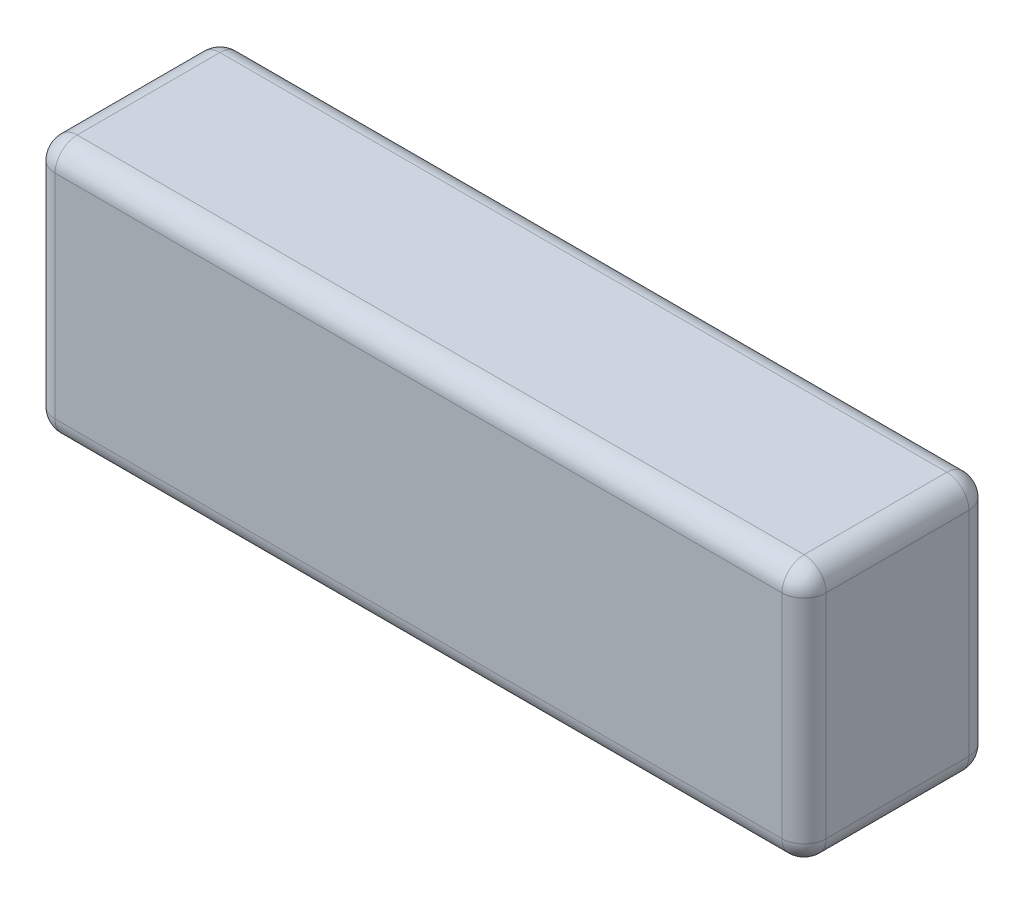
ISO-10303-21;
HEADER;
FILE_DESCRIPTION(('STEP AP214'),'2;1');
FILE_NAME('part.step','',(''),(''),'','','');
FILE_SCHEMA(('AUTOMOTIVE_DESIGN { 1 0 10303 214 1 1 1 1 }'));
ENDSEC;
DATA;
#1=APPLICATION_CONTEXT('core data for automotive mechanical design processes');
#2=APPLICATION_PROTOCOL_DEFINITION('international standard','automotive_design',2000,#1);
#3=PRODUCT_CONTEXT('',#1,'mechanical');
#4=PRODUCT('Part','Part','',(#3));
#5=PRODUCT_RELATED_PRODUCT_CATEGORY('part','',(#4));
#6=PRODUCT_DEFINITION_FORMATION('','',#4);
#7=PRODUCT_DEFINITION_CONTEXT('part definition',#1,'design');
#8=PRODUCT_DEFINITION('design','',#6,#7);
#9=PRODUCT_DEFINITION_SHAPE('','',#8);
#10=(LENGTH_UNIT() NAMED_UNIT(*) SI_UNIT(.MILLI.,.METRE.));
#11=(NAMED_UNIT(*) PLANE_ANGLE_UNIT() SI_UNIT($,.RADIAN.));
#12=(NAMED_UNIT(*) SI_UNIT($,.STERADIAN.) SOLID_ANGLE_UNIT());
#13=UNCERTAINTY_MEASURE_WITH_UNIT(LENGTH_MEASURE(1.E-05),#10,'distance_accuracy_value','');
#14=(GEOMETRIC_REPRESENTATION_CONTEXT(3) GLOBAL_UNCERTAINTY_ASSIGNED_CONTEXT((#13)) GLOBAL_UNIT_ASSIGNED_CONTEXT((#10,
#11,#12)) REPRESENTATION_CONTEXT('',''));
#15=CARTESIAN_POINT('',(0.,0.,0.));
#16=DIRECTION('',(0.,0.,1.));
#17=DIRECTION('',(1.,0.,0.));
#18=AXIS2_PLACEMENT_3D('',#15,#16,#17);
#19=CARTESIAN_POINT('',(-49.3875,14.4625,-9.7));
#20=DIRECTION('',(1.,0.,0.));
#21=DIRECTION('',(0.,0.,-1.));
#22=AXIS2_PLACEMENT_3D('',#19,#20,#21);
#23=CYLINDRICAL_SURFACE('',#22,3.);
#24=CARTESIAN_POINT('',(-49.3875,14.4625,-9.7));
#25=DIRECTION('',(-1.,0.,0.));
#26=DIRECTION('',(0.,0.,1.));
#27=AXIS2_PLACEMENT_3D('',#24,#25,#26);
#28=CIRCLE('',#27,3.);
#29=CARTESIAN_POINT('',(-49.3875,17.4625,-9.7));
#30=VERTEX_POINT('',#29);
#31=CARTESIAN_POINT('',(-49.3875,14.4625,-12.7));
#32=VERTEX_POINT('',#31);
#33=EDGE_CURVE('E11',#30,#32,#28,.T.);
#34=ORIENTED_EDGE('',*,*,#33,.F.);
#35=DIRECTION('',(-1.,0.,0.));
#36=VECTOR('',#35,1.);
#37=CARTESIAN_POINT('',(-49.3875,17.4625,-9.7));
#38=LINE('',#37,#36);
#39=CARTESIAN_POINT('',(49.3875,17.4625,-9.7));
#40=VERTEX_POINT('',#39);
#41=EDGE_CURVE('E247',#40,#30,#38,.T.);
#42=ORIENTED_EDGE('',*,*,#41,.F.);
#43=CARTESIAN_POINT('',(49.3875,14.4625,-9.7));
#44=DIRECTION('',(-1.,0.,0.));
#45=DIRECTION('',(0.,-1.,0.));
#46=AXIS2_PLACEMENT_3D('',#43,#44,#45);
#47=CIRCLE('',#46,3.);
#48=CARTESIAN_POINT('',(49.3875,14.4625,-12.7));
#49=VERTEX_POINT('',#48);
#50=EDGE_CURVE('E42',#40,#49,#47,.T.);
#51=ORIENTED_EDGE('',*,*,#50,.T.);
#52=DIRECTION('',(-1.,0.,0.));
#53=VECTOR('',#52,1.);
#54=CARTESIAN_POINT('',(-49.3875,14.4625,-12.7));
#55=LINE('',#54,#53);
#56=EDGE_CURVE('E223',#32,#49,#55,.F.);
#57=ORIENTED_EDGE('',*,*,#56,.F.);
#58=EDGE_LOOP('',(#34,#42,#51,#57));
#59=FACE_BOUND('',#58,.T.);
#60=ADVANCED_FACE('F35',(#59),#23,.T.);
#61=CARTESIAN_POINT('',(49.3875,14.4625,-9.7));
#62=DIRECTION('',(0.,0.,-1.));
#63=DIRECTION('',(-1.,0.,0.));
#64=AXIS2_PLACEMENT_3D('',#61,#62,#63);
#65=SPHERICAL_SURFACE('',#64,3.);
#66=ORIENTED_EDGE('',*,*,#50,.F.);
#67=CARTESIAN_POINT('',(49.3875,14.4625,-9.7));
#68=DIRECTION('',(0.,0.,-1.));
#69=DIRECTION('',(-1.,0.,0.));
#70=AXIS2_PLACEMENT_3D('',#67,#68,#69);
#71=CIRCLE('',#70,3.);
#72=CARTESIAN_POINT('',(52.3875,14.4625,-9.7));
#73=VERTEX_POINT('',#72);
#74=EDGE_CURVE('E244',#73,#40,#71,.F.);
#75=ORIENTED_EDGE('',*,*,#74,.F.);
#76=CARTESIAN_POINT('',(49.3875,14.4625,-9.7));
#77=DIRECTION('',(0.,1.,0.));
#78=DIRECTION('',(0.,0.,1.));
#79=AXIS2_PLACEMENT_3D('',#76,#77,#78);
#80=CIRCLE('',#79,3.);
#81=EDGE_CURVE('E55',#73,#49,#80,.T.);
#82=ORIENTED_EDGE('',*,*,#81,.T.);
#83=EDGE_LOOP('',(#66,#75,#82));
#84=FACE_BOUND('',#83,.T.);
#85=ADVANCED_FACE('F265',(#84),#65,.T.);
#86=CARTESIAN_POINT('',(49.3875,14.4625,-9.7));
#87=DIRECTION('',(0.,-1.,0.));
#88=DIRECTION('',(0.,0.,-1.));
#89=AXIS2_PLACEMENT_3D('',#86,#87,#88);
#90=CYLINDRICAL_SURFACE('',#89,3.);
#91=ORIENTED_EDGE('',*,*,#81,.F.);
#92=DIRECTION('',(0.,1.,0.));
#93=VECTOR('',#92,1.);
#94=CARTESIAN_POINT('',(52.3875,14.4625,-9.7));
#95=LINE('',#94,#93);
#96=CARTESIAN_POINT('',(52.3875,-14.4625,-9.7));
#97=VERTEX_POINT('',#96);
#98=EDGE_CURVE('E242',#97,#73,#95,.T.);
#99=ORIENTED_EDGE('',*,*,#98,.F.);
#100=CARTESIAN_POINT('',(49.3875,-14.4625,-9.7));
#101=DIRECTION('',(0.,1.,0.));
#102=DIRECTION('',(-1.,0.,0.));
#103=AXIS2_PLACEMENT_3D('',#100,#101,#102);
#104=CIRCLE('',#103,3.);
#105=CARTESIAN_POINT('',(49.3875,-14.4625,-12.7));
#106=VERTEX_POINT('',#105);
#107=EDGE_CURVE('E261',#97,#106,#104,.T.);
#108=ORIENTED_EDGE('',*,*,#107,.T.);
#109=DIRECTION('',(0.,1.,0.));
#110=VECTOR('',#109,1.);
#111=CARTESIAN_POINT('',(49.3875,14.4625,-12.7));
#112=LINE('',#111,#110);
#113=EDGE_CURVE('E226',#49,#106,#112,.F.);
#114=ORIENTED_EDGE('',*,*,#113,.F.);
#115=EDGE_LOOP('',(#91,#99,#108,#114));
#116=FACE_BOUND('',#115,.T.);
#117=ADVANCED_FACE('F266',(#116),#90,.T.);
#118=CARTESIAN_POINT('',(49.3875,-14.4625,-9.7));
#119=DIRECTION('',(0.,0.,-1.));
#120=DIRECTION('',(-1.,0.,0.));
#121=AXIS2_PLACEMENT_3D('',#118,#119,#120);
#122=SPHERICAL_SURFACE('',#121,3.);
#123=ORIENTED_EDGE('',*,*,#107,.F.);
#124=CARTESIAN_POINT('',(49.3875,-14.4625,-9.7));
#125=DIRECTION('',(0.,0.,-1.));
#126=DIRECTION('',(-1.,0.,0.));
#127=AXIS2_PLACEMENT_3D('',#124,#125,#126);
#128=CIRCLE('',#127,3.);
#129=CARTESIAN_POINT('',(49.3875,-17.4625,-9.7));
#130=VERTEX_POINT('',#129);
#131=EDGE_CURVE('E161',#130,#97,#128,.F.);
#132=ORIENTED_EDGE('',*,*,#131,.F.);
#133=CARTESIAN_POINT('',(49.3875,-14.4625,-9.7));
#134=DIRECTION('',(1.,0.,0.));
#135=DIRECTION('',(0.,0.,-1.));
#136=AXIS2_PLACEMENT_3D('',#133,#134,#135);
#137=CIRCLE('',#136,3.);
#138=EDGE_CURVE('E258',#130,#106,#137,.T.);
#139=ORIENTED_EDGE('',*,*,#138,.T.);
#140=EDGE_LOOP('',(#123,#132,#139));
#141=FACE_BOUND('',#140,.T.);
#142=ADVANCED_FACE('F325',(#141),#122,.T.);
#143=CARTESIAN_POINT('',(-49.3875,-14.4625,-9.7));
#144=DIRECTION('',(-1.,0.,0.));
#145=DIRECTION('',(0.,0.,1.));
#146=AXIS2_PLACEMENT_3D('',#143,#144,#145);
#147=CYLINDRICAL_SURFACE('',#146,3.);
#148=ORIENTED_EDGE('',*,*,#138,.F.);
#149=DIRECTION('',(1.,0.,0.));
#150=VECTOR('',#149,1.);
#151=CARTESIAN_POINT('',(-49.3875,-17.4625,-9.7));
#152=LINE('',#151,#150);
#153=CARTESIAN_POINT('',(-49.3875,-17.4625,-9.7));
#154=VERTEX_POINT('',#153);
#155=EDGE_CURVE('E238',#154,#130,#152,.T.);
#156=ORIENTED_EDGE('',*,*,#155,.F.);
#157=CARTESIAN_POINT('',(-49.3875,-14.4625,-9.7));
#158=DIRECTION('',(1.,0.,0.));
#159=DIRECTION('',(0.,1.,0.));
#160=AXIS2_PLACEMENT_3D('',#157,#158,#159);
#161=CIRCLE('',#160,3.);
#162=CARTESIAN_POINT('',(-49.3875,-14.4625,-12.7));
#163=VERTEX_POINT('',#162);
#164=EDGE_CURVE('E256',#154,#163,#161,.T.);
#165=ORIENTED_EDGE('',*,*,#164,.T.);
#166=DIRECTION('',(1.,0.,0.));
#167=VECTOR('',#166,1.);
#168=CARTESIAN_POINT('',(-49.3875,-14.4625,-12.7));
#169=LINE('',#168,#167);
#170=EDGE_CURVE('E229',#106,#163,#169,.F.);
#171=ORIENTED_EDGE('',*,*,#170,.F.);
#172=EDGE_LOOP('',(#148,#156,#165,#171));
#173=FACE_BOUND('',#172,.T.);
#174=ADVANCED_FACE('F323',(#173),#147,.T.);
#175=CARTESIAN_POINT('',(-49.3875,-14.4625,-9.7));
#176=DIRECTION('',(0.,0.,-1.));
#177=DIRECTION('',(-1.,0.,0.));
#178=AXIS2_PLACEMENT_3D('',#175,#176,#177);
#179=SPHERICAL_SURFACE('',#178,3.);
#180=ORIENTED_EDGE('',*,*,#164,.F.);
#181=CARTESIAN_POINT('',(-49.3875,-14.4625,-9.7));
#182=DIRECTION('',(0.,0.,-1.));
#183=DIRECTION('',(-1.,0.,0.));
#184=AXIS2_PLACEMENT_3D('',#181,#182,#183);
#185=CIRCLE('',#184,3.);
#186=CARTESIAN_POINT('',(-52.3875,-14.4625,-9.7));
#187=VERTEX_POINT('',#186);
#188=EDGE_CURVE('E235',#187,#154,#185,.F.);
#189=ORIENTED_EDGE('',*,*,#188,.F.);
#190=CARTESIAN_POINT('',(-49.3875,-14.4625,-9.7));
#191=DIRECTION('',(0.,-1.,0.));
#192=DIRECTION('',(0.,0.,-1.));
#193=AXIS2_PLACEMENT_3D('',#190,#191,#192);
#194=CIRCLE('',#193,3.);
#195=EDGE_CURVE('E253',#187,#163,#194,.T.);
#196=ORIENTED_EDGE('',*,*,#195,.T.);
#197=EDGE_LOOP('',(#180,#189,#196));
#198=FACE_BOUND('',#197,.T.);
#199=ADVANCED_FACE('F320',(#198),#179,.T.);
#200=CARTESIAN_POINT('',(-49.3875,14.4625,-9.7));
#201=DIRECTION('',(0.,1.,0.));
#202=DIRECTION('',(0.,0.,1.));
#203=AXIS2_PLACEMENT_3D('',#200,#201,#202);
#204=CYLINDRICAL_SURFACE('',#203,3.);
#205=ORIENTED_EDGE('',*,*,#195,.F.);
#206=DIRECTION('',(0.,-1.,0.));
#207=VECTOR('',#206,1.);
#208=CARTESIAN_POINT('',(-52.3875,14.4625,-9.7));
#209=LINE('',#208,#207);
#210=CARTESIAN_POINT('',(-52.3875,14.4625,-9.7));
#211=VERTEX_POINT('',#210);
#212=EDGE_CURVE('E220',#211,#187,#209,.T.);
#213=ORIENTED_EDGE('',*,*,#212,.F.);
#214=CARTESIAN_POINT('',(-49.3875,14.4625,-9.7));
#215=DIRECTION('',(0.,-1.,0.));
#216=DIRECTION('',(1.,0.,0.));
#217=AXIS2_PLACEMENT_3D('',#214,#215,#216);
#218=CIRCLE('',#217,3.);
#219=EDGE_CURVE('E250',#211,#32,#218,.T.);
#220=ORIENTED_EDGE('',*,*,#219,.T.);
#221=DIRECTION('',(0.,-1.,0.));
#222=VECTOR('',#221,1.);
#223=CARTESIAN_POINT('',(-49.3875,14.4625,-12.7));
#224=LINE('',#223,#222);
#225=EDGE_CURVE('E232',#163,#32,#224,.F.);
#226=ORIENTED_EDGE('',*,*,#225,.F.);
#227=EDGE_LOOP('',(#205,#213,#220,#226));
#228=FACE_BOUND('',#227,.T.);
#229=ADVANCED_FACE('F272',(#228),#204,.T.);
#230=CARTESIAN_POINT('',(-49.3875,14.4625,-9.7));
#231=DIRECTION('',(0.,0.,-1.));
#232=DIRECTION('',(-1.,0.,0.));
#233=AXIS2_PLACEMENT_3D('',#230,#231,#232);
#234=SPHERICAL_SURFACE('',#233,3.);
#235=CARTESIAN_POINT('',(-49.3875,14.4625,-9.7));
#236=DIRECTION('',(0.,0.,-1.));
#237=DIRECTION('',(-1.,0.,0.));
#238=AXIS2_PLACEMENT_3D('',#235,#236,#237);
#239=CIRCLE('',#238,3.);
#240=EDGE_CURVE('E217',#30,#211,#239,.F.);
#241=ORIENTED_EDGE('',*,*,#240,.F.);
#242=ORIENTED_EDGE('',*,*,#33,.T.);
#243=ORIENTED_EDGE('',*,*,#219,.F.);
#244=EDGE_LOOP('',(#241,#242,#243));
#245=FACE_BOUND('',#244,.T.);
#246=ADVANCED_FACE('F277',(#245),#234,.T.);
#247=CARTESIAN_POINT('',(49.3875,-14.4625,9.7));
#248=DIRECTION('',(1.,0.,0.));
#249=DIRECTION('',(0.,0.,-1.));
#250=AXIS2_PLACEMENT_3D('',#247,#248,#249);
#251=CYLINDRICAL_SURFACE('',#250,3.);
#252=CARTESIAN_POINT('',(49.3875,-14.4625,9.7));
#253=DIRECTION('',(1.,0.,0.));
#254=DIRECTION('',(0.,0.,-1.));
#255=AXIS2_PLACEMENT_3D('',#252,#253,#254);
#256=CIRCLE('',#255,3.);
#257=CARTESIAN_POINT('',(49.3875,-14.4625,12.7));
#258=VERTEX_POINT('',#257);
#259=CARTESIAN_POINT('',(49.3875,-17.4625,9.7));
#260=VERTEX_POINT('',#259);
#261=EDGE_CURVE('E150',#258,#260,#256,.T.);
#262=ORIENTED_EDGE('',*,*,#261,.F.);
#263=DIRECTION('',(1.,0.,0.));
#264=VECTOR('',#263,1.);
#265=CARTESIAN_POINT('',(49.3875,-14.4625,12.7));
#266=LINE('',#265,#264);
#267=CARTESIAN_POINT('',(-49.3875,-14.4625,12.7));
#268=VERTEX_POINT('',#267);
#269=EDGE_CURVE('E155',#268,#258,#266,.T.);
#270=ORIENTED_EDGE('',*,*,#269,.F.);
#271=CARTESIAN_POINT('',(-49.3875,-14.4625,9.7));
#272=DIRECTION('',(1.,0.,0.));
#273=DIRECTION('',(0.,1.,0.));
#274=AXIS2_PLACEMENT_3D('',#271,#272,#273);
#275=CIRCLE('',#274,3.);
#276=CARTESIAN_POINT('',(-49.3875,-17.4625,9.7));
#277=VERTEX_POINT('',#276);
#278=EDGE_CURVE('E214',#268,#277,#275,.T.);
#279=ORIENTED_EDGE('',*,*,#278,.T.);
#280=DIRECTION('',(1.,0.,0.));
#281=VECTOR('',#280,1.);
#282=CARTESIAN_POINT('',(-49.3875,-17.4625,9.7));
#283=LINE('',#282,#281);
#284=EDGE_CURVE('E135',#260,#277,#283,.F.);
#285=ORIENTED_EDGE('',*,*,#284,.F.);
#286=EDGE_LOOP('',(#262,#270,#279,#285));
#287=FACE_BOUND('',#286,.T.);
#288=ADVANCED_FACE('F310',(#287),#251,.T.);
#289=CARTESIAN_POINT('',(-49.3875,-14.4625,9.7));
#290=DIRECTION('',(0.,0.,-1.));
#291=DIRECTION('',(-1.,0.,0.));
#292=AXIS2_PLACEMENT_3D('',#289,#290,#291);
#293=SPHERICAL_SURFACE('',#292,3.);
#294=ORIENTED_EDGE('',*,*,#278,.F.);
#295=CARTESIAN_POINT('',(-49.3875,-14.4625,9.7));
#296=DIRECTION('',(0.,-1.,0.));
#297=DIRECTION('',(0.,0.,-1.));
#298=AXIS2_PLACEMENT_3D('',#295,#296,#297);
#299=CIRCLE('',#298,3.);
#300=CARTESIAN_POINT('',(-52.3875,-14.4625,9.7));
#301=VERTEX_POINT('',#300);
#302=EDGE_CURVE('E212',#268,#301,#299,.T.);
#303=ORIENTED_EDGE('',*,*,#302,.T.);
#304=CARTESIAN_POINT('',(-49.3875,-14.4625,9.7));
#305=DIRECTION('',(0.,0.,-1.));
#306=DIRECTION('',(-1.,0.,0.));
#307=AXIS2_PLACEMENT_3D('',#304,#305,#306);
#308=CIRCLE('',#307,3.);
#309=EDGE_CURVE('E200',#277,#301,#308,.T.);
#310=ORIENTED_EDGE('',*,*,#309,.F.);
#311=EDGE_LOOP('',(#294,#303,#310));
#312=FACE_BOUND('',#311,.T.);
#313=ADVANCED_FACE('F316',(#312),#293,.T.);
#314=CARTESIAN_POINT('',(-49.3875,14.4625,9.7));
#315=DIRECTION('',(0.,-1.,0.));
#316=DIRECTION('',(0.,0.,-1.));
#317=AXIS2_PLACEMENT_3D('',#314,#315,#316);
#318=CYLINDRICAL_SURFACE('',#317,3.);
#319=ORIENTED_EDGE('',*,*,#302,.F.);
#320=DIRECTION('',(0.,-1.,0.));
#321=VECTOR('',#320,1.);
#322=CARTESIAN_POINT('',(-49.3875,14.4625,12.7));
#323=LINE('',#322,#321);
#324=CARTESIAN_POINT('',(-49.3875,14.4625,12.7));
#325=VERTEX_POINT('',#324);
#326=EDGE_CURVE('E182',#325,#268,#323,.T.);
#327=ORIENTED_EDGE('',*,*,#326,.F.);
#328=CARTESIAN_POINT('',(-49.3875,14.4625,9.7));
#329=DIRECTION('',(0.,-1.,0.));
#330=DIRECTION('',(1.,0.,0.));
#331=AXIS2_PLACEMENT_3D('',#328,#329,#330);
#332=CIRCLE('',#331,3.);
#333=CARTESIAN_POINT('',(-52.3875,14.4625,9.7));
#334=VERTEX_POINT('',#333);
#335=EDGE_CURVE('E210',#325,#334,#332,.T.);
#336=ORIENTED_EDGE('',*,*,#335,.T.);
#337=DIRECTION('',(0.,-1.,0.));
#338=VECTOR('',#337,1.);
#339=CARTESIAN_POINT('',(-52.3875,14.4625,9.7));
#340=LINE('',#339,#338);
#341=EDGE_CURVE('E197',#301,#334,#340,.F.);
#342=ORIENTED_EDGE('',*,*,#341,.F.);
#343=EDGE_LOOP('',(#319,#327,#336,#342));
#344=FACE_BOUND('',#343,.T.);
#345=ADVANCED_FACE('F308',(#344),#318,.T.);
#346=CARTESIAN_POINT('',(-49.3875,14.4625,9.7));
#347=DIRECTION('',(0.,0.,-1.));
#348=DIRECTION('',(-1.,0.,0.));
#349=AXIS2_PLACEMENT_3D('',#346,#347,#348);
#350=SPHERICAL_SURFACE('',#349,3.);
#351=ORIENTED_EDGE('',*,*,#335,.F.);
#352=CARTESIAN_POINT('',(-49.3875,14.4625,9.7));
#353=DIRECTION('',(-1.,0.,0.));
#354=DIRECTION('',(0.,0.,1.));
#355=AXIS2_PLACEMENT_3D('',#352,#353,#354);
#356=CIRCLE('',#355,3.);
#357=CARTESIAN_POINT('',(-49.3875,17.4625,9.7));
#358=VERTEX_POINT('',#357);
#359=EDGE_CURVE('E208',#325,#358,#356,.T.);
#360=ORIENTED_EDGE('',*,*,#359,.T.);
#361=CARTESIAN_POINT('',(-49.3875,14.4625,9.7));
#362=DIRECTION('',(0.,0.,-1.));
#363=DIRECTION('',(-1.,0.,0.));
#364=AXIS2_PLACEMENT_3D('',#361,#362,#363);
#365=CIRCLE('',#364,3.);
#366=EDGE_CURVE('E194',#334,#358,#365,.T.);
#367=ORIENTED_EDGE('',*,*,#366,.F.);
#368=EDGE_LOOP('',(#351,#360,#367));
#369=FACE_BOUND('',#368,.T.);
#370=ADVANCED_FACE('F298',(#369),#350,.T.);
#371=CARTESIAN_POINT('',(49.3875,14.4625,9.7));
#372=DIRECTION('',(-1.,0.,0.));
#373=DIRECTION('',(0.,0.,1.));
#374=AXIS2_PLACEMENT_3D('',#371,#372,#373);
#375=CYLINDRICAL_SURFACE('',#374,3.);
#376=ORIENTED_EDGE('',*,*,#359,.F.);
#377=DIRECTION('',(-1.,0.,0.));
#378=VECTOR('',#377,1.);
#379=CARTESIAN_POINT('',(49.3875,14.4625,12.7));
#380=LINE('',#379,#378);
#381=CARTESIAN_POINT('',(49.3875,14.4625,12.7));
#382=VERTEX_POINT('',#381);
#383=EDGE_CURVE('E185',#382,#325,#380,.T.);
#384=ORIENTED_EDGE('',*,*,#383,.F.);
#385=CARTESIAN_POINT('',(49.3875,14.4625,9.7));
#386=DIRECTION('',(-1.,0.,0.));
#387=DIRECTION('',(0.,-1.,0.));
#388=AXIS2_PLACEMENT_3D('',#385,#386,#387);
#389=CIRCLE('',#388,3.);
#390=CARTESIAN_POINT('',(49.3875,17.4625,9.7));
#391=VERTEX_POINT('',#390);
#392=EDGE_CURVE('E206',#382,#391,#389,.T.);
#393=ORIENTED_EDGE('',*,*,#392,.T.);
#394=DIRECTION('',(-1.,0.,0.));
#395=VECTOR('',#394,1.);
#396=CARTESIAN_POINT('',(-49.3875,17.4625,9.7));
#397=LINE('',#396,#395);
#398=EDGE_CURVE('E191',#358,#391,#397,.F.);
#399=ORIENTED_EDGE('',*,*,#398,.F.);
#400=EDGE_LOOP('',(#376,#384,#393,#399));
#401=FACE_BOUND('',#400,.T.);
#402=ADVANCED_FACE('F295',(#401),#375,.T.);
#403=CARTESIAN_POINT('',(49.3875,14.4625,9.7));
#404=DIRECTION('',(0.,0.,-1.));
#405=DIRECTION('',(-1.,0.,0.));
#406=AXIS2_PLACEMENT_3D('',#403,#404,#405);
#407=SPHERICAL_SURFACE('',#406,3.);
#408=ORIENTED_EDGE('',*,*,#392,.F.);
#409=CARTESIAN_POINT('',(49.3875,14.4625,9.7));
#410=DIRECTION('',(0.,1.,0.));
#411=DIRECTION('',(0.,0.,1.));
#412=AXIS2_PLACEMENT_3D('',#409,#410,#411);
#413=CIRCLE('',#412,3.);
#414=CARTESIAN_POINT('',(52.3875,14.4625,9.7));
#415=VERTEX_POINT('',#414);
#416=EDGE_CURVE('E134',#382,#415,#413,.T.);
#417=ORIENTED_EDGE('',*,*,#416,.T.);
#418=CARTESIAN_POINT('',(49.3875,14.4625,9.7));
#419=DIRECTION('',(0.,0.,-1.));
#420=DIRECTION('',(-1.,0.,0.));
#421=AXIS2_PLACEMENT_3D('',#418,#419,#420);
#422=CIRCLE('',#421,3.);
#423=EDGE_CURVE('E145',#391,#415,#422,.T.);
#424=ORIENTED_EDGE('',*,*,#423,.F.);
#425=EDGE_LOOP('',(#408,#417,#424));
#426=FACE_BOUND('',#425,.T.);
#427=ADVANCED_FACE('F287',(#426),#407,.T.);
#428=CARTESIAN_POINT('',(49.3875,14.4625,9.7));
#429=DIRECTION('',(0.,1.,0.));
#430=DIRECTION('',(0.,0.,1.));
#431=AXIS2_PLACEMENT_3D('',#428,#429,#430);
#432=CYLINDRICAL_SURFACE('',#431,3.);
#433=ORIENTED_EDGE('',*,*,#416,.F.);
#434=DIRECTION('',(0.,1.,0.));
#435=VECTOR('',#434,1.);
#436=CARTESIAN_POINT('',(49.3875,14.4625,12.7));
#437=LINE('',#436,#435);
#438=EDGE_CURVE('E130',#258,#382,#437,.T.);
#439=ORIENTED_EDGE('',*,*,#438,.F.);
#440=CARTESIAN_POINT('',(49.3875,-14.4625,9.7));
#441=DIRECTION('',(0.,1.,0.));
#442=DIRECTION('',(-1.,0.,0.));
#443=AXIS2_PLACEMENT_3D('',#440,#441,#442);
#444=CIRCLE('',#443,3.);
#445=CARTESIAN_POINT('',(52.3875,-14.4625,9.7));
#446=VERTEX_POINT('',#445);
#447=EDGE_CURVE('E123',#258,#446,#444,.T.);
#448=ORIENTED_EDGE('',*,*,#447,.T.);
#449=DIRECTION('',(0.,1.,0.));
#450=VECTOR('',#449,1.);
#451=CARTESIAN_POINT('',(52.3875,14.4625,9.7));
#452=LINE('',#451,#450);
#453=EDGE_CURVE('E127',#415,#446,#452,.F.);
#454=ORIENTED_EDGE('',*,*,#453,.F.);
#455=EDGE_LOOP('',(#433,#439,#448,#454));
#456=FACE_BOUND('',#455,.T.);
#457=ADVANCED_FACE('F126',(#456),#432,.T.);
#458=CARTESIAN_POINT('',(49.3875,-14.4625,9.7));
#459=DIRECTION('',(0.,0.,-1.));
#460=DIRECTION('',(-1.,0.,0.));
#461=AXIS2_PLACEMENT_3D('',#458,#459,#460);
#462=SPHERICAL_SURFACE('',#461,3.);
#463=ORIENTED_EDGE('',*,*,#447,.F.);
#464=ORIENTED_EDGE('',*,*,#261,.T.);
#465=CARTESIAN_POINT('',(49.3875,-14.4625,9.7));
#466=DIRECTION('',(0.,0.,-1.));
#467=DIRECTION('',(-1.,0.,0.));
#468=AXIS2_PLACEMENT_3D('',#465,#466,#467);
#469=CIRCLE('',#468,3.);
#470=EDGE_CURVE('E148',#446,#260,#469,.T.);
#471=ORIENTED_EDGE('',*,*,#470,.F.);
#472=EDGE_LOOP('',(#463,#464,#471));
#473=FACE_BOUND('',#472,.T.);
#474=ADVANCED_FACE('F149',(#473),#462,.T.);
#475=CARTESIAN_POINT('',(49.3875,14.4625,12.7));
#476=DIRECTION('',(0.,0.,-1.));
#477=DIRECTION('',(-1.,0.,0.));
#478=AXIS2_PLACEMENT_3D('',#475,#476,#477);
#479=CYLINDRICAL_SURFACE('',#478,3.);
#480=DIRECTION('',(0.,0.,-1.));
#481=VECTOR('',#480,1.);
#482=CARTESIAN_POINT('',(52.3875,14.4625,12.7));
#483=LINE('',#482,#481);
#484=EDGE_CURVE('E144',#415,#73,#483,.T.);
#485=ORIENTED_EDGE('',*,*,#484,.T.);
#486=ORIENTED_EDGE('',*,*,#74,.T.);
#487=DIRECTION('',(0.,0.,-1.));
#488=VECTOR('',#487,1.);
#489=CARTESIAN_POINT('',(49.3875,17.4625,12.7));
#490=LINE('',#489,#488);
#491=EDGE_CURVE('E156',#391,#40,#490,.T.);
#492=ORIENTED_EDGE('',*,*,#491,.F.);
#493=ORIENTED_EDGE('',*,*,#423,.T.);
#494=EDGE_LOOP('',(#485,#486,#492,#493));
#495=FACE_BOUND('',#494,.T.);
#496=ADVANCED_FACE('F285',(#495),#479,.T.);
#497=CARTESIAN_POINT('',(-49.3875,17.4625,12.7));
#498=DIRECTION('',(0.,-1.,0.));
#499=DIRECTION('',(0.,0.,-1.));
#500=AXIS2_PLACEMENT_3D('',#497,#498,#499);
#501=PLANE('',#500);
#502=ORIENTED_EDGE('',*,*,#491,.T.);
#503=ORIENTED_EDGE('',*,*,#41,.T.);
#504=DIRECTION('',(0.,0.,-1.));
#505=VECTOR('',#504,1.);
#506=CARTESIAN_POINT('',(-49.3875,17.4625,12.7));
#507=LINE('',#506,#505);
#508=EDGE_CURVE('E176',#358,#30,#507,.T.);
#509=ORIENTED_EDGE('',*,*,#508,.F.);
#510=ORIENTED_EDGE('',*,*,#398,.T.);
#511=EDGE_LOOP('',(#502,#503,#509,#510));
#512=FACE_BOUND('',#511,.T.);
#513=ADVANCED_FACE('F280',(#512),#501,.F.);
#514=CARTESIAN_POINT('',(-49.3875,14.4625,12.7));
#515=DIRECTION('',(0.,0.,-1.));
#516=DIRECTION('',(-1.,0.,0.));
#517=AXIS2_PLACEMENT_3D('',#514,#515,#516);
#518=CYLINDRICAL_SURFACE('',#517,3.);
#519=ORIENTED_EDGE('',*,*,#508,.T.);
#520=ORIENTED_EDGE('',*,*,#240,.T.);
#521=DIRECTION('',(0.,0.,-1.));
#522=VECTOR('',#521,1.);
#523=CARTESIAN_POINT('',(-52.3875,14.4625,12.7));
#524=LINE('',#523,#522);
#525=EDGE_CURVE('E173',#334,#211,#524,.T.);
#526=ORIENTED_EDGE('',*,*,#525,.F.);
#527=ORIENTED_EDGE('',*,*,#366,.T.);
#528=EDGE_LOOP('',(#519,#520,#526,#527));
#529=FACE_BOUND('',#528,.T.);
#530=ADVANCED_FACE('F301',(#529),#518,.T.);
#531=CARTESIAN_POINT('',(-52.3875,14.4625,12.7));
#532=DIRECTION('',(1.,0.,0.));
#533=DIRECTION('',(0.,0.,-1.));
#534=AXIS2_PLACEMENT_3D('',#531,#532,#533);
#535=PLANE('',#534);
#536=ORIENTED_EDGE('',*,*,#525,.T.);
#537=ORIENTED_EDGE('',*,*,#212,.T.);
#538=DIRECTION('',(0.,0.,-1.));
#539=VECTOR('',#538,1.);
#540=CARTESIAN_POINT('',(-52.3875,-14.4625,12.7));
#541=LINE('',#540,#539);
#542=EDGE_CURVE('E170',#301,#187,#541,.T.);
#543=ORIENTED_EDGE('',*,*,#542,.F.);
#544=ORIENTED_EDGE('',*,*,#341,.T.);
#545=EDGE_LOOP('',(#536,#537,#543,#544));
#546=FACE_BOUND('',#545,.T.);
#547=ADVANCED_FACE('F303',(#546),#535,.F.);
#548=CARTESIAN_POINT('',(-49.3875,-14.4625,12.7));
#549=DIRECTION('',(0.,0.,-1.));
#550=DIRECTION('',(-1.,0.,0.));
#551=AXIS2_PLACEMENT_3D('',#548,#549,#550);
#552=CYLINDRICAL_SURFACE('',#551,3.);
#553=ORIENTED_EDGE('',*,*,#542,.T.);
#554=ORIENTED_EDGE('',*,*,#188,.T.);
#555=DIRECTION('',(0.,0.,-1.));
#556=VECTOR('',#555,1.);
#557=CARTESIAN_POINT('',(-49.3875,-17.4625,12.7));
#558=LINE('',#557,#556);
#559=EDGE_CURVE('E164',#277,#154,#558,.T.);
#560=ORIENTED_EDGE('',*,*,#559,.F.);
#561=ORIENTED_EDGE('',*,*,#309,.T.);
#562=EDGE_LOOP('',(#553,#554,#560,#561));
#563=FACE_BOUND('',#562,.T.);
#564=ADVANCED_FACE('F318',(#563),#552,.T.);
#565=CARTESIAN_POINT('',(-49.3875,-17.4625,12.7));
#566=DIRECTION('',(0.,1.,0.));
#567=DIRECTION('',(0.,0.,1.));
#568=AXIS2_PLACEMENT_3D('',#565,#566,#567);
#569=PLANE('',#568);
#570=ORIENTED_EDGE('',*,*,#559,.T.);
#571=ORIENTED_EDGE('',*,*,#155,.T.);
#572=DIRECTION('',(0.,0.,-1.));
#573=VECTOR('',#572,1.);
#574=CARTESIAN_POINT('',(49.3875,-17.4625,12.7));
#575=LINE('',#574,#573);
#576=EDGE_CURVE('E162',#260,#130,#575,.T.);
#577=ORIENTED_EDGE('',*,*,#576,.F.);
#578=ORIENTED_EDGE('',*,*,#284,.T.);
#579=EDGE_LOOP('',(#570,#571,#577,#578));
#580=FACE_BOUND('',#579,.T.);
#581=ADVANCED_FACE('F313',(#580),#569,.F.);
#582=CARTESIAN_POINT('',(49.3875,-14.4625,12.7));
#583=DIRECTION('',(0.,0.,-1.));
#584=DIRECTION('',(-1.,0.,0.));
#585=AXIS2_PLACEMENT_3D('',#582,#583,#584);
#586=CYLINDRICAL_SURFACE('',#585,3.);
#587=ORIENTED_EDGE('',*,*,#576,.T.);
#588=ORIENTED_EDGE('',*,*,#131,.T.);
#589=DIRECTION('',(0.,0.,-1.));
#590=VECTOR('',#589,1.);
#591=CARTESIAN_POINT('',(52.3875,-14.4625,12.7));
#592=LINE('',#591,#590);
#593=EDGE_CURVE('E142',#446,#97,#592,.T.);
#594=ORIENTED_EDGE('',*,*,#593,.F.);
#595=ORIENTED_EDGE('',*,*,#470,.T.);
#596=EDGE_LOOP('',(#587,#588,#594,#595));
#597=FACE_BOUND('',#596,.T.);
#598=ADVANCED_FACE('F159',(#597),#586,.T.);
#599=CARTESIAN_POINT('',(52.3875,14.4625,12.7));
#600=DIRECTION('',(-1.,0.,0.));
#601=DIRECTION('',(0.,0.,1.));
#602=AXIS2_PLACEMENT_3D('',#599,#600,#601);
#603=PLANE('',#602);
#604=ORIENTED_EDGE('',*,*,#593,.T.);
#605=ORIENTED_EDGE('',*,*,#98,.T.);
#606=ORIENTED_EDGE('',*,*,#484,.F.);
#607=ORIENTED_EDGE('',*,*,#453,.T.);
#608=EDGE_LOOP('',(#604,#605,#606,#607));
#609=FACE_BOUND('',#608,.T.);
#610=ADVANCED_FACE('F139',(#609),#603,.F.);
#611=CARTESIAN_POINT('',(49.3875,14.4625,12.7));
#612=DIRECTION('',(0.,0.,-1.));
#613=DIRECTION('',(-1.,0.,0.));
#614=AXIS2_PLACEMENT_3D('',#611,#612,#613);
#615=PLANE('',#614);
#616=ORIENTED_EDGE('',*,*,#269,.T.);
#617=ORIENTED_EDGE('',*,*,#438,.T.);
#618=ORIENTED_EDGE('',*,*,#383,.T.);
#619=ORIENTED_EDGE('',*,*,#326,.T.);
#620=EDGE_LOOP('',(#616,#617,#618,#619));
#621=FACE_BOUND('',#620,.T.);
#622=ADVANCED_FACE('F290',(#621),#615,.F.);
#623=CARTESIAN_POINT('',(49.3875,14.4625,-12.7));
#624=DIRECTION('',(0.,0.,-1.));
#625=DIRECTION('',(-1.,0.,0.));
#626=AXIS2_PLACEMENT_3D('',#623,#624,#625);
#627=PLANE('',#626);
#628=ORIENTED_EDGE('',*,*,#170,.T.);
#629=ORIENTED_EDGE('',*,*,#225,.T.);
#630=ORIENTED_EDGE('',*,*,#56,.T.);
#631=ORIENTED_EDGE('',*,*,#113,.T.);
#632=EDGE_LOOP('',(#628,#629,#630,#631));
#633=FACE_BOUND('',#632,.T.);
#634=ADVANCED_FACE('F268',(#633),#627,.T.);
#635=CLOSED_SHELL('',(#60,#85,#117,#142,#174,#199,#229,#246,#288,#313,#345,#370,#402,#427,#457,
#474,#496,#513,#530,#547,#564,#581,#598,#610,#622,#634));
#636=MANIFOLD_SOLID_BREP('B2',#635);
#637=ADVANCED_BREP_SHAPE_REPRESENTATION('',(#18,#636),#14);
#638=SHAPE_DEFINITION_REPRESENTATION(#9,#637);
ENDSEC;
END-ISO-10303-21;
